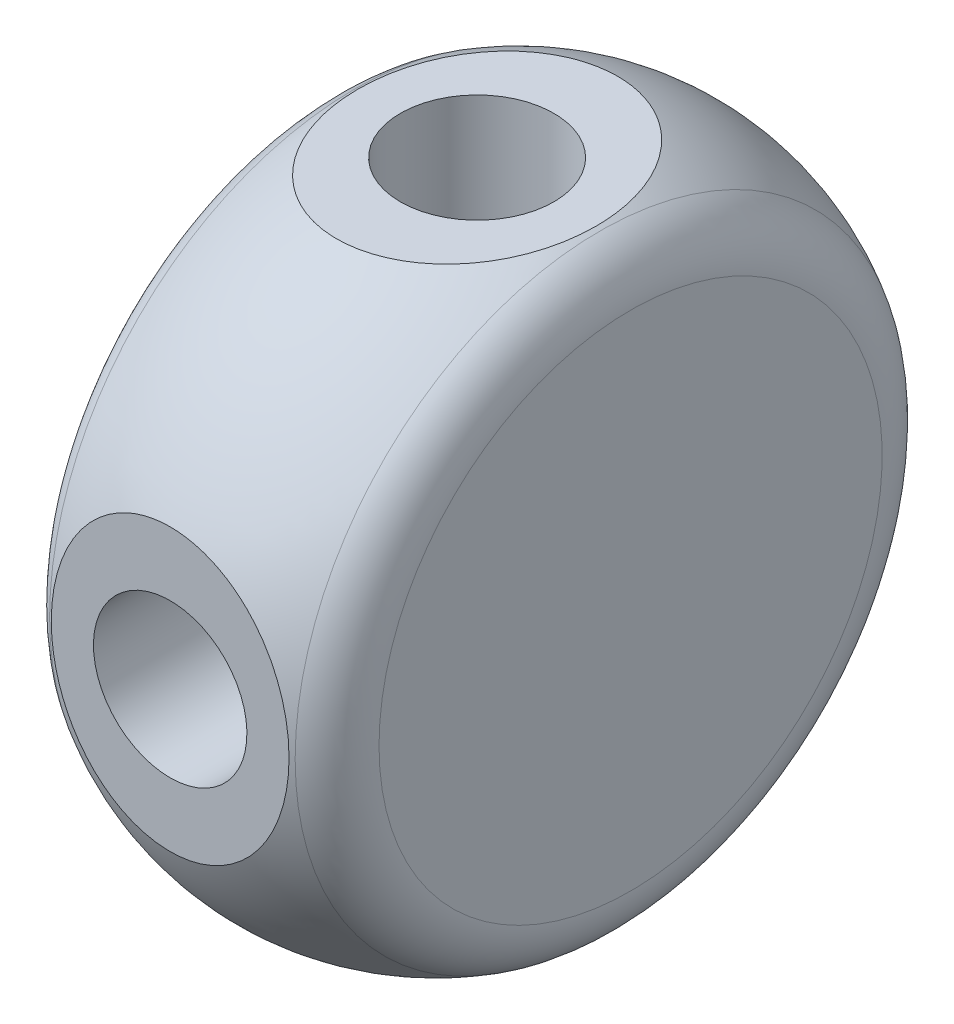
ISO-10303-21;
HEADER;
FILE_DESCRIPTION(('STEP AP214'),'2;1');
FILE_NAME('part.step','',(''),(''),'','','');
FILE_SCHEMA(('AUTOMOTIVE_DESIGN { 1 0 10303 214 1 1 1 1 }'));
ENDSEC;
DATA;
#1=APPLICATION_CONTEXT('core data for automotive mechanical design processes');
#2=APPLICATION_PROTOCOL_DEFINITION('international standard','automotive_design',2000,#1);
#3=PRODUCT_CONTEXT('',#1,'mechanical');
#4=PRODUCT('Part','Part','',(#3));
#5=PRODUCT_RELATED_PRODUCT_CATEGORY('part','',(#4));
#6=PRODUCT_DEFINITION_FORMATION('','',#4);
#7=PRODUCT_DEFINITION_CONTEXT('part definition',#1,'design');
#8=PRODUCT_DEFINITION('design','',#6,#7);
#9=PRODUCT_DEFINITION_SHAPE('','',#8);
#10=(LENGTH_UNIT() NAMED_UNIT(*) SI_UNIT(.MILLI.,.METRE.));
#11=(NAMED_UNIT(*) PLANE_ANGLE_UNIT() SI_UNIT($,.RADIAN.));
#12=(NAMED_UNIT(*) SI_UNIT($,.STERADIAN.) SOLID_ANGLE_UNIT());
#13=UNCERTAINTY_MEASURE_WITH_UNIT(LENGTH_MEASURE(1.E-05),#10,'distance_accuracy_value','');
#14=(GEOMETRIC_REPRESENTATION_CONTEXT(3) GLOBAL_UNCERTAINTY_ASSIGNED_CONTEXT((#13)) GLOBAL_UNIT_ASSIGNED_CONTEXT((#10,
#11,#12)) REPRESENTATION_CONTEXT('',''));
#15=CARTESIAN_POINT('',(0.,0.,0.));
#16=DIRECTION('',(0.,0.,1.));
#17=DIRECTION('',(1.,0.,0.));
#18=AXIS2_PLACEMENT_3D('',#15,#16,#17);
#19=CARTESIAN_POINT('',(5.,-10.,-10.));
#20=DIRECTION('',(0.,0.,1.));
#21=DIRECTION('',(1.,0.,0.));
#22=AXIS2_PLACEMENT_3D('',#19,#20,#21);
#23=PLANE('',#22);
#24=CARTESIAN_POINT('',(3.87298334620741,0.,-10.));
#25=CARTESIAN_POINT('',(3.87298143017548,0.279957520606064,-10.));
#26=CARTESIAN_POINT('',(3.85176677455792,0.559896835077255,-10.));
#27=CARTESIAN_POINT('',(3.7665606306825,1.11326238190932,-10.));
#28=CARTESIAN_POINT('',(3.70257310719076,1.38668921550217,-10.));
#29=CARTESIAN_POINT('',(3.53063827992377,1.9209885462289,-10.));
#30=CARTESIAN_POINT('',(3.42247853053202,2.18179346136854,-10.));
#31=CARTESIAN_POINT('',(3.16168106965632,2.68016623312731,-10.));
#32=CARTESIAN_POINT('',(3.00909782696853,2.91776207335374,-10.));
#33=CARTESIAN_POINT('',(2.69812905853208,3.31134252154961,-10.));
#34=CARTESIAN_POINT('',(2.54804045689744,3.47389174900208,-10.));
#35=CARTESIAN_POINT('',(2.22297414634522,3.77198773760056,-10.));
#36=CARTESIAN_POINT('',(2.04800815895245,3.90754714379708,-10.));
#37=CARTESIAN_POINT('',(1.67557220452734,4.14622112933546,-10.));
#38=CARTESIAN_POINT('',(1.47797598048434,4.24914027458737,-10.));
#39=CARTESIAN_POINT('',(1.06682784799633,4.41572601255386,-10.));
#40=CARTESIAN_POINT('',(0.85328472903932,4.47941405192765,-10.));
#41=CARTESIAN_POINT('',(0.441105690578487,4.55916846131039,-10.));
#42=CARTESIAN_POINT('',(0.243304705010542,4.57958472048624,-10.));
#43=CARTESIAN_POINT('',(-0.152741993315411,4.58495142770175,-10.));
#44=CARTESIAN_POINT('',(-0.350987511995703,4.5699151420116,-10.));
#45=CARTESIAN_POINT('',(-0.73169957258078,4.50685955689153,-10.));
#46=CARTESIAN_POINT('',(-0.914455401704624,4.46055997457647,-10.));
#47=CARTESIAN_POINT('',(-1.26997311343723,4.33889779612495,-10.));
#48=CARTESIAN_POINT('',(-1.4427345131991,4.26353379718619,-10.));
#49=CARTESIAN_POINT('',(-1.77991237755477,4.08390496116987,-10.));
#50=CARTESIAN_POINT('',(-1.94385670259872,3.9787580777535,-10.));
#51=CARTESIAN_POINT('',(-2.25384471642858,3.7448257329369,-10.));
#52=CARTESIAN_POINT('',(-2.39988237417273,3.61603234356777,-10.));
#53=CARTESIAN_POINT('',(-2.6859936426692,3.32488281779702,-10.));
#54=CARTESIAN_POINT('',(-2.82394207693669,3.16044376459161,-10.));
#55=CARTESIAN_POINT('',(-3.07446823495818,2.81331682335827,-10.));
#56=CARTESIAN_POINT('',(-3.18703320948738,2.63061983119233,-10.));
#57=CARTESIAN_POINT('',(-3.4012070866735,2.22364521486725,-10.));
#58=CARTESIAN_POINT('',(-3.49872479002235,1.99721660432412,-10.));
#59=CARTESIAN_POINT('',(-3.66012181783056,1.53270625258898,-10.));
#60=CARTESIAN_POINT('',(-3.72398188120313,1.29461792393192,-10.));
#61=CARTESIAN_POINT('',(-3.82589301940467,0.774545079538806,-10.));
#62=CARTESIAN_POINT('',(-3.85841914412832,0.491470386210998,-10.));
#63=CARTESIAN_POINT('',(-3.8797623491435,-0.0764975538597966,-10.));
#64=CARTESIAN_POINT('',(-3.86853927245221,-0.361392231619545,-10.));
#65=CARTESIAN_POINT('',(-3.79919868038874,-0.951010930343232,-10.));
#66=CARTESIAN_POINT('',(-3.73704175367597,-1.25527397076717,-10.));
#67=CARTESIAN_POINT('',(-3.55967325644482,-1.84789713138825,-10.));
#68=CARTESIAN_POINT('',(-3.44452216046521,-2.13627496018074,-10.));
#69=CARTESIAN_POINT('',(-3.19177243390459,-2.62509422105768,-10.));
#70=CARTESIAN_POINT('',(-3.06463122467638,-2.83095300112767,-10.));
#71=CARTESIAN_POINT('',(-2.77813500787323,-3.21904774045745,-10.));
#72=CARTESIAN_POINT('',(-2.61879457232285,-3.401294324599,-10.));
#73=CARTESIAN_POINT('',(-2.26860556995729,-3.73568762587949,-10.));
#74=CARTESIAN_POINT('',(-2.0775315149527,-3.88760043839341,-10.));
#75=CARTESIAN_POINT('',(-1.6693119944919,-4.15120387188347,-10.));
#76=CARTESIAN_POINT('',(-1.45218892161163,-4.26292871401259,-10.));
#77=CARTESIAN_POINT('',(-1.02975910907204,-4.42713581994434,-10.));
#78=CARTESIAN_POINT('',(-0.826747568730762,-4.48553772753667,-10.));
#79=CARTESIAN_POINT('',(-0.413422167270741,-4.56345958921248,-10.));
#80=CARTESIAN_POINT('',(-0.20311342087555,-4.58300623896564,-10.));
#81=CARTESIAN_POINT('',(0.197552952285403,-4.582171208404,-10.));
#82=CARTESIAN_POINT('',(0.387927831310903,-4.56536982684571,-10.));
#83=CARTESIAN_POINT('',(0.763055929417474,-4.49982767041402,-10.));
#84=CARTESIAN_POINT('',(0.947809914635324,-4.45109126892892,-10.));
#85=CARTESIAN_POINT('',(1.30581844800081,-4.32427503219908,-10.));
#86=CARTESIAN_POINT('',(1.47912677061879,-4.24634590754814,-10.));
#87=CARTESIAN_POINT('',(1.81139768665816,-4.06438519428418,-10.));
#88=CARTESIAN_POINT('',(1.97035692516982,-3.96034752270473,-10.));
#89=CARTESIAN_POINT('',(2.28199602309428,-3.72161990617662,-10.));
#90=CARTESIAN_POINT('',(2.43339017961488,-3.58525722226644,-10.));
#91=CARTESIAN_POINT('',(2.71432030871885,-3.29170374500117,-10.));
#92=CARTESIAN_POINT('',(2.84384820822773,-3.13450529710343,-10.));
#93=CARTESIAN_POINT('',(3.09534301025823,-2.78233628395102,-10.));
#94=CARTESIAN_POINT('',(3.21414782260403,-2.58511126450315,-10.));
#95=CARTESIAN_POINT('',(3.42219491037417,-2.17563216352104,-10.));
#96=CARTESIAN_POINT('',(3.51141207378325,-1.96336550012516,-10.));
#97=CARTESIAN_POINT('',(3.68202450206601,-1.46595625769731,-10.));
#98=CARTESIAN_POINT('',(3.75372710215285,-1.17746503015102,-10.));
#99=CARTESIAN_POINT('',(3.84922375512668,-0.592645848643336,-10.));
#100=CARTESIAN_POINT('',(3.87298537417452,-0.296312726577976,-10.));
#101=CARTESIAN_POINT('',(3.87298334620741,0.,-10.));
#102=B_SPLINE_CURVE_WITH_KNOTS('',3,(#24,#25,#26,#27,#28,#29,#30,#31,#32,#33,#34,#35,#36,#37,
#38,#39,#40,#41,#42,#43,#44,#45,#46,#47,#48,#49,#50,#51,#52,#53,#54,#55,#56,#57,#58,#59,#60,#61,
#62,#63,#64,#65,#66,#67,#68,#69,#70,#71,#72,#73,#74,#75,#76,#77,#78,#79,#80,#81,#82,#83,#84,#85,
#86,#87,#88,#89,#90,#91,#92,#93,#94,#95,#96,#97,#98,#99,#100,#101),.UNSPECIFIED.,.T.,.F.,(4,2,2,
2,2,2,2,2,2,2,2,2,2,2,2,2,2,2,2,2,2,2,2,2,2,2,2,2,2,2,2,2,2,2,2,2,2,2,4),(0.,0.839023297615926,
1.6779688340225,2.52099769417838,3.36299721693534,4.02401079220315,4.68471394224237,
5.34930147599779,6.01352537327571,6.6069987557304,7.20025009689892,7.76327184748769,
8.32632077588248,8.90819515486145,9.49026497641159,10.1316646876194,10.7733858374819,
11.5101408020567,12.2473169291207,13.0985988218639,13.9506622822042,14.8776999717725,
15.8036823812397,16.5266377974021,17.2492667639377,17.9772693063725,18.7046504590106,
19.3348780488382,19.9646724882621,20.5352705946096,21.1057905758863,21.6734048926031,
22.24115157937,22.8499614378851,23.4589955811909,24.1470584206917,24.8357037561689,
25.7231428732277,26.6111821744789),.UNSPECIFIED.);
#103=CARTESIAN_POINT('',(3.87298334620741,0.,-10.));
#104=VERTEX_POINT('',#103);
#105=EDGE_CURVE('E125',#104,#104,#102,.T.);
#106=ORIENTED_EDGE('',*,*,#105,.F.);
#107=EDGE_LOOP('',(#106));
#108=FACE_BOUND('',#107,.T.);
#109=CARTESIAN_POINT('',(0.,1.04744440165294E-13,-10.));
#110=DIRECTION('',(0.,0.,-1.));
#111=DIRECTION('',(0.,1.,0.));
#112=AXIS2_PLACEMENT_3D('',#109,#110,#111);
#113=CIRCLE('',#112,2.49999999999999);
#114=CARTESIAN_POINT('',(0.,2.5000000000001,-9.99999999999998));
#115=VERTEX_POINT('',#114);
#116=EDGE_CURVE('E66',#115,#115,#113,.T.);
#117=ORIENTED_EDGE('',*,*,#116,.F.);
#118=EDGE_LOOP('',(#117));
#119=FACE_BOUND('',#118,.T.);
#120=ADVANCED_FACE('F34',(#108,#119),#23,.F.);
#121=CARTESIAN_POINT('',(5.,-10.,10.));
#122=DIRECTION('',(0.,0.,-1.));
#123=DIRECTION('',(-1.,0.,0.));
#124=AXIS2_PLACEMENT_3D('',#121,#122,#123);
#125=PLANE('',#124);
#126=CARTESIAN_POINT('',(3.87298334620743,0.,10.));
#127=CARTESIAN_POINT('',(3.8729814301755,-0.279957520606058,10.));
#128=CARTESIAN_POINT('',(3.85176677455793,-0.559896835077251,10.));
#129=CARTESIAN_POINT('',(3.76656063068251,-1.11326238190932,10.));
#130=CARTESIAN_POINT('',(3.70257310719077,-1.38668921550217,10.));
#131=CARTESIAN_POINT('',(3.53063827992378,-1.9209885462289,10.));
#132=CARTESIAN_POINT('',(3.42247853053203,-2.18179346136854,10.));
#133=CARTESIAN_POINT('',(3.16168106965633,-2.68016623312732,10.));
#134=CARTESIAN_POINT('',(3.00909782696854,-2.91776207335375,10.));
#135=CARTESIAN_POINT('',(2.69812905853208,-3.31134252154963,10.));
#136=CARTESIAN_POINT('',(2.54804045689745,-3.47389174900209,10.));
#137=CARTESIAN_POINT('',(2.22297414634523,-3.77198773760058,10.));
#138=CARTESIAN_POINT('',(2.04800815895246,-3.90754714379709,10.));
#139=CARTESIAN_POINT('',(1.67557220452735,-4.14622112933548,10.));
#140=CARTESIAN_POINT('',(1.47797598048435,-4.24914027458739,10.));
#141=CARTESIAN_POINT('',(1.06682784799634,-4.41572601255388,10.));
#142=CARTESIAN_POINT('',(0.853284729039325,-4.47941405192766,10.));
#143=CARTESIAN_POINT('',(0.441105690578491,-4.5591684613104,10.));
#144=CARTESIAN_POINT('',(0.243304705010545,-4.57958472048626,10.));
#145=CARTESIAN_POINT('',(-0.152741993315408,-4.58495142770177,10.));
#146=CARTESIAN_POINT('',(-0.350987511995701,-4.56991514201162,10.));
#147=CARTESIAN_POINT('',(-0.731699572580778,-4.50685955689154,10.));
#148=CARTESIAN_POINT('',(-0.914455401704622,-4.46055997457648,10.));
#149=CARTESIAN_POINT('',(-1.26997311343723,-4.33889779612497,10.));
#150=CARTESIAN_POINT('',(-1.4427345131991,-4.2635337971862,10.));
#151=CARTESIAN_POINT('',(-1.77991237755478,-4.08390496116989,10.));
#152=CARTESIAN_POINT('',(-1.94385670259872,-3.97875807775352,10.));
#153=CARTESIAN_POINT('',(-2.25384471642859,-3.74482573293691,10.));
#154=CARTESIAN_POINT('',(-2.39988237417274,-3.61603234356779,10.));
#155=CARTESIAN_POINT('',(-2.68599364266921,-3.32488281779704,10.));
#156=CARTESIAN_POINT('',(-2.8239420769367,-3.16044376459162,10.));
#157=CARTESIAN_POINT('',(-3.07446823495819,-2.81331682335829,10.));
#158=CARTESIAN_POINT('',(-3.18703320948738,-2.63061983119235,10.));
#159=CARTESIAN_POINT('',(-3.40120708667351,-2.22364521486726,10.));
#160=CARTESIAN_POINT('',(-3.49872479002236,-1.99721660432413,10.));
#161=CARTESIAN_POINT('',(-3.66012181783057,-1.53270625258899,10.));
#162=CARTESIAN_POINT('',(-3.72398188120314,-1.29461792393193,10.));
#163=CARTESIAN_POINT('',(-3.82589301940468,-0.774545079538814,10.));
#164=CARTESIAN_POINT('',(-3.85841914412833,-0.491470386211007,10.));
#165=CARTESIAN_POINT('',(-3.87976234914352,0.0764975538597888,10.));
#166=CARTESIAN_POINT('',(-3.86853927245222,0.361392231619539,10.));
#167=CARTESIAN_POINT('',(-3.79919868038875,0.951010930343229,10.));
#168=CARTESIAN_POINT('',(-3.73704175367599,1.25527397076717,10.));
#169=CARTESIAN_POINT('',(-3.55967325644484,1.84789713138825,10.));
#170=CARTESIAN_POINT('',(-3.44452216046522,2.13627496018074,10.));
#171=CARTESIAN_POINT('',(-3.19177243390461,2.62509422105769,10.));
#172=CARTESIAN_POINT('',(-3.06463122467639,2.83095300112768,10.));
#173=CARTESIAN_POINT('',(-2.77813500787325,3.21904774045746,10.));
#174=CARTESIAN_POINT('',(-2.61879457232286,3.40129432459901,10.));
#175=CARTESIAN_POINT('',(-2.2686055699573,3.7356876258795,10.));
#176=CARTESIAN_POINT('',(-2.07753151495271,3.88760043839342,10.));
#177=CARTESIAN_POINT('',(-1.66931199449192,4.15120387188348,10.));
#178=CARTESIAN_POINT('',(-1.45218892161164,4.2629287140126,10.));
#179=CARTESIAN_POINT('',(-1.02975910907205,4.42713581994436,10.));
#180=CARTESIAN_POINT('',(-0.826747568730772,4.48553772753668,10.));
#181=CARTESIAN_POINT('',(-0.413422167270748,4.56345958921249,10.));
#182=CARTESIAN_POINT('',(-0.203113420875558,4.58300623896565,10.));
#183=CARTESIAN_POINT('',(0.197552952285397,4.58217120840401,10.));
#184=CARTESIAN_POINT('',(0.387927831310898,4.56536982684573,10.));
#185=CARTESIAN_POINT('',(0.763055929417471,4.49982767041404,10.));
#186=CARTESIAN_POINT('',(0.947809914635321,4.45109126892894,10.));
#187=CARTESIAN_POINT('',(1.30581844800081,4.3242750321991,10.));
#188=CARTESIAN_POINT('',(1.47912677061879,4.24634590754816,10.));
#189=CARTESIAN_POINT('',(1.81139768665816,4.0643851942842,10.));
#190=CARTESIAN_POINT('',(1.97035692516982,3.96034752270475,10.));
#191=CARTESIAN_POINT('',(2.28199602309429,3.72161990617664,10.));
#192=CARTESIAN_POINT('',(2.43339017961488,3.58525722226646,10.));
#193=CARTESIAN_POINT('',(2.71432030871885,3.29170374500119,10.));
#194=CARTESIAN_POINT('',(2.84384820822774,3.13450529710345,10.));
#195=CARTESIAN_POINT('',(3.09534301025824,2.78233628395104,10.));
#196=CARTESIAN_POINT('',(3.21414782260404,2.58511126450317,10.));
#197=CARTESIAN_POINT('',(3.42219491037418,2.17563216352106,10.));
#198=CARTESIAN_POINT('',(3.51141207378326,1.96336550012518,10.));
#199=CARTESIAN_POINT('',(3.68202450206602,1.46595625769733,10.));
#200=CARTESIAN_POINT('',(3.75372710215286,1.17746503015103,10.));
#201=CARTESIAN_POINT('',(3.84922375512669,0.592645848643346,10.));
#202=CARTESIAN_POINT('',(3.87298537417454,0.296312726577984,10.));
#203=CARTESIAN_POINT('',(3.87298334620743,0.,10.));
#204=B_SPLINE_CURVE_WITH_KNOTS('',3,(#126,#127,#128,#129,#130,#131,#132,#133,#134,#135,#136,
#137,#138,#139,#140,#141,#142,#143,#144,#145,#146,#147,#148,#149,#150,#151,#152,#153,#154,#155,
#156,#157,#158,#159,#160,#161,#162,#163,#164,#165,#166,#167,#168,#169,#170,#171,#172,#173,#174,
#175,#176,#177,#178,#179,#180,#181,#182,#183,#184,#185,#186,#187,#188,#189,#190,#191,#192,#193,
#194,#195,#196,#197,#198,#199,#200,#201,#202,#203),.UNSPECIFIED.,.T.,.F.,(4,2,2,2,2,2,2,2,2,2,2,
2,2,2,2,2,2,2,2,2,2,2,2,2,2,2,2,2,2,2,2,2,2,2,2,2,2,2,4),(0.,0.839023297615931,1.67796883402251,
2.52099769417839,3.36299721693536,4.02401079220317,4.68471394224239,5.34930147599781,
6.01352537327574,6.60699875573042,7.20025009689894,7.76327184748772,8.32632077588252,
8.90819515486149,9.49026497641163,10.1316646876195,10.773385837482,11.5101408020567,
12.2473169291208,13.098598821864,13.9506622822043,14.8776999717725,15.8036823812397,
16.5266377974022,17.2492667639378,17.9772693063725,18.7046504590107,19.3348780488382,
19.9646724882622,20.5352705946097,21.1057905758863,21.6734048926032,22.24115157937,
22.8499614378852,23.4589955811909,24.1470584206917,24.835703756169,25.7231428732278,
26.611182174479),.UNSPECIFIED.);
#205=CARTESIAN_POINT('',(3.87298334620743,0.,10.));
#206=VERTEX_POINT('',#205);
#207=EDGE_CURVE('E96',#206,#206,#204,.T.);
#208=ORIENTED_EDGE('',*,*,#207,.F.);
#209=EDGE_LOOP('',(#208));
#210=FACE_BOUND('',#209,.T.);
#211=CARTESIAN_POINT('',(0.,0.,10.));
#212=DIRECTION('',(0.,0.,1.));
#213=DIRECTION('',(0.,-1.,0.));
#214=AXIS2_PLACEMENT_3D('',#211,#212,#213);
#215=CIRCLE('',#214,2.49999999999999);
#216=CARTESIAN_POINT('',(0.,-2.50000000000003,10.));
#217=VERTEX_POINT('',#216);
#218=EDGE_CURVE('E76',#217,#217,#215,.T.);
#219=ORIENTED_EDGE('',*,*,#218,.F.);
#220=EDGE_LOOP('',(#219));
#221=FACE_BOUND('',#220,.T.);
#222=ADVANCED_FACE('F111',(#210,#221),#125,.F.);
#223=CARTESIAN_POINT('',(0.,0.,0.));
#224=DIRECTION('',(-1.,0.,0.));
#225=DIRECTION('',(0.,0.,1.));
#226=AXIS2_PLACEMENT_3D('',#223,#224,#225);
#227=DEGENERATE_TOROIDAL_SURFACE('',#226,3.,8.,.T.);
#228=CARTESIAN_POINT('',(-4.,0.,0.));
#229=DIRECTION('',(1.,0.,0.));
#230=DIRECTION('',(0.,0.,-1.));
#231=AXIS2_PLACEMENT_3D('',#228,#229,#230);
#232=CIRCLE('',#231,9.92820323027551);
#233=CARTESIAN_POINT('',(-4.,0.,-9.92820323027551));
#234=VERTEX_POINT('',#233);
#235=EDGE_CURVE('E42',#234,#234,#232,.T.);
#236=ORIENTED_EDGE('',*,*,#235,.T.);
#237=EDGE_LOOP('',(#236));
#238=FACE_BOUND('',#237,.T.);
#239=CARTESIAN_POINT('',(4.,0.,0.));
#240=DIRECTION('',(-1.,0.,0.));
#241=DIRECTION('',(0.,0.,1.));
#242=AXIS2_PLACEMENT_3D('',#239,#240,#241);
#243=CIRCLE('',#242,9.92820323027551);
#244=CARTESIAN_POINT('',(4.,0.,9.92820323027551));
#245=VERTEX_POINT('',#244);
#246=EDGE_CURVE('E156',#245,#245,#243,.T.);
#247=ORIENTED_EDGE('',*,*,#246,.T.);
#248=EDGE_LOOP('',(#247));
#249=FACE_BOUND('',#248,.T.);
#250=CARTESIAN_POINT('',(3.87298334620743,-10.,0.));
#251=CARTESIAN_POINT('',(3.8729814301755,-10.,-0.279957520606065));
#252=CARTESIAN_POINT('',(3.85176677455793,-10.,-0.559896835077258));
#253=CARTESIAN_POINT('',(3.76656063068251,-10.,-1.11326238190933));
#254=CARTESIAN_POINT('',(3.70257310719077,-10.,-1.38668921550217));
#255=CARTESIAN_POINT('',(3.53063827992378,-10.,-1.92098854622891));
#256=CARTESIAN_POINT('',(3.42247853053203,-10.,-2.18179346136855));
#257=CARTESIAN_POINT('',(3.16168106965633,-10.,-2.68016623312733));
#258=CARTESIAN_POINT('',(3.00909782696854,-10.,-2.91776207335375));
#259=CARTESIAN_POINT('',(2.69812905853208,-10.,-3.31134252154963));
#260=CARTESIAN_POINT('',(2.54804045689744,-10.,-3.4738917490021));
#261=CARTESIAN_POINT('',(2.22297414634522,-10.,-3.77198773760058));
#262=CARTESIAN_POINT('',(2.04800815895245,-10.,-3.9075471437971));
#263=CARTESIAN_POINT('',(1.67557220452734,-10.,-4.14622112933548));
#264=CARTESIAN_POINT('',(1.47797598048434,-10.,-4.24914027458739));
#265=CARTESIAN_POINT('',(1.06682784799633,-10.,-4.41572601255388));
#266=CARTESIAN_POINT('',(0.85328472903932,-10.,-4.47941405192766));
#267=CARTESIAN_POINT('',(0.441105690578486,-10.,-4.5591684613104));
#268=CARTESIAN_POINT('',(0.24330470501054,-10.,-4.57958472048626));
#269=CARTESIAN_POINT('',(-0.152741993315414,-10.,-4.58495142770177));
#270=CARTESIAN_POINT('',(-0.350987511995707,-10.,-4.56991514201162));
#271=CARTESIAN_POINT('',(-0.731699572580785,-10.,-4.50685955689154));
#272=CARTESIAN_POINT('',(-0.91445540170463,-10.,-4.46055997457649));
#273=CARTESIAN_POINT('',(-1.26997311343723,-10.,-4.33889779612497));
#274=CARTESIAN_POINT('',(-1.4427345131991,-10.,-4.2635337971862));
#275=CARTESIAN_POINT('',(-1.77991237755478,-10.,-4.08390496116988));
#276=CARTESIAN_POINT('',(-1.94385670259873,-10.,-3.97875807775351));
#277=CARTESIAN_POINT('',(-2.25384471642859,-10.,-3.74482573293691));
#278=CARTESIAN_POINT('',(-2.39988237417274,-10.,-3.61603234356778));
#279=CARTESIAN_POINT('',(-2.68599364266921,-10.,-3.32488281779703));
#280=CARTESIAN_POINT('',(-2.8239420769367,-10.,-3.16044376459162));
#281=CARTESIAN_POINT('',(-3.07446823495819,-10.,-2.81331682335828));
#282=CARTESIAN_POINT('',(-3.18703320948739,-10.,-2.63061983119234));
#283=CARTESIAN_POINT('',(-3.40120708667351,-10.,-2.22364521486725));
#284=CARTESIAN_POINT('',(-3.49872479002237,-10.,-1.99721660432413));
#285=CARTESIAN_POINT('',(-3.66012181783058,-10.,-1.53270625258898));
#286=CARTESIAN_POINT('',(-3.72398188120314,-10.,-1.29461792393192));
#287=CARTESIAN_POINT('',(-3.82589301940468,-10.,-0.774545079538805));
#288=CARTESIAN_POINT('',(-3.85841914412833,-10.,-0.491470386210997));
#289=CARTESIAN_POINT('',(-3.87976234914352,-10.,0.0764975538597993));
#290=CARTESIAN_POINT('',(-3.86853927245222,-10.,0.361392231619549));
#291=CARTESIAN_POINT('',(-3.79919868038875,-10.,0.951010930343238));
#292=CARTESIAN_POINT('',(-3.73704175367598,-10.,1.25527397076718));
#293=CARTESIAN_POINT('',(-3.55967325644483,-10.,1.84789713138826));
#294=CARTESIAN_POINT('',(-3.44452216046522,-10.,2.13627496018075));
#295=CARTESIAN_POINT('',(-3.1917724339046,-10.,2.62509422105769));
#296=CARTESIAN_POINT('',(-3.06463122467638,-10.,2.83095300112768));
#297=CARTESIAN_POINT('',(-2.77813500787324,-10.,3.21904774045746));
#298=CARTESIAN_POINT('',(-2.61879457232285,-10.,3.40129432459901));
#299=CARTESIAN_POINT('',(-2.26860556995729,-10.,3.73568762587951));
#300=CARTESIAN_POINT('',(-2.0775315149527,-10.,3.88760043839343));
#301=CARTESIAN_POINT('',(-1.66931199449191,-10.,4.15120387188348));
#302=CARTESIAN_POINT('',(-1.45218892161164,-10.,4.26292871401261));
#303=CARTESIAN_POINT('',(-1.02975910907205,-10.,4.42713581994436));
#304=CARTESIAN_POINT('',(-0.826747568730765,-10.,4.48553772753669));
#305=CARTESIAN_POINT('',(-0.413422167270742,-10.,4.56345958921249));
#306=CARTESIAN_POINT('',(-0.203113420875551,-10.,4.58300623896565));
#307=CARTESIAN_POINT('',(0.197552952285402,-10.,4.58217120840401));
#308=CARTESIAN_POINT('',(0.387927831310902,-10.,4.56536982684573));
#309=CARTESIAN_POINT('',(0.763055929417475,-10.,4.49982767041404));
#310=CARTESIAN_POINT('',(0.947809914635326,-10.,4.45109126892894));
#311=CARTESIAN_POINT('',(1.30581844800081,-10.,4.3242750321991));
#312=CARTESIAN_POINT('',(1.47912677061879,-10.,4.24634590754815));
#313=CARTESIAN_POINT('',(1.81139768665816,-10.,4.0643851942842));
#314=CARTESIAN_POINT('',(1.97035692516983,-10.,3.96034752270474));
#315=CARTESIAN_POINT('',(2.28199602309429,-10.,3.72161990617664));
#316=CARTESIAN_POINT('',(2.43339017961489,-10.,3.58525722226645));
#317=CARTESIAN_POINT('',(2.71432030871886,-10.,3.29170374500119));
#318=CARTESIAN_POINT('',(2.84384820822774,-10.,3.13450529710345));
#319=CARTESIAN_POINT('',(3.09534301025824,-10.,2.78233628395103));
#320=CARTESIAN_POINT('',(3.21414782260404,-10.,2.58511126450317));
#321=CARTESIAN_POINT('',(3.42219491037419,-10.,2.17563216352105));
#322=CARTESIAN_POINT('',(3.51141207378326,-10.,1.96336550012517));
#323=CARTESIAN_POINT('',(3.68202450206602,-10.,1.46595625769732));
#324=CARTESIAN_POINT('',(3.75372710215286,-10.,1.17746503015102));
#325=CARTESIAN_POINT('',(3.84922375512669,-10.,0.592645848643339));
#326=CARTESIAN_POINT('',(3.87298537417454,-10.,0.296312726577977));
#327=CARTESIAN_POINT('',(3.87298334620743,-10.,0.));
#328=B_SPLINE_CURVE_WITH_KNOTS('',3,(#250,#251,#252,#253,#254,#255,#256,#257,#258,#259,#260,
#261,#262,#263,#264,#265,#266,#267,#268,#269,#270,#271,#272,#273,#274,#275,#276,#277,#278,#279,
#280,#281,#282,#283,#284,#285,#286,#287,#288,#289,#290,#291,#292,#293,#294,#295,#296,#297,#298,
#299,#300,#301,#302,#303,#304,#305,#306,#307,#308,#309,#310,#311,#312,#313,#314,#315,#316,#317,
#318,#319,#320,#321,#322,#323,#324,#325,#326,#327),.UNSPECIFIED.,.T.,.F.,(4,2,2,2,2,2,2,2,2,2,2,
2,2,2,2,2,2,2,2,2,2,2,2,2,2,2,2,2,2,2,2,2,2,2,2,2,2,2,4),(0.,0.83902329761593,1.67796883402251,
2.5209976941784,3.36299721693536,4.02401079220317,4.68471394224239,5.34930147599781,
6.01352537327574,6.60699875573042,7.20025009689895,7.76327184748772,8.32632077588252,
8.90819515486149,9.49026497641163,10.1316646876195,10.773385837482,11.5101408020567,
12.2473169291208,13.098598821864,13.9506622822043,14.8776999717725,15.8036823812397,
16.5266377974022,17.2492667639378,17.9772693063725,18.7046504590107,19.3348780488382,
19.9646724882622,20.5352705946097,21.1057905758863,21.6734048926032,22.2411515793701,
22.8499614378852,23.458995581191,24.1470584206917,24.835703756169,25.7231428732278,
26.611182174479),.UNSPECIFIED.);
#329=CARTESIAN_POINT('',(3.87298334620743,-10.,0.));
#330=VERTEX_POINT('',#329);
#331=EDGE_CURVE('E88',#330,#330,#328,.T.);
#332=ORIENTED_EDGE('',*,*,#331,.T.);
#333=EDGE_LOOP('',(#332));
#334=FACE_BOUND('',#333,.T.);
#335=ORIENTED_EDGE('',*,*,#207,.T.);
#336=EDGE_LOOP('',(#335));
#337=FACE_BOUND('',#336,.T.);
#338=CARTESIAN_POINT('',(3.87298334620741,10.,0.));
#339=CARTESIAN_POINT('',(3.87298143017548,10.,0.279957520606057));
#340=CARTESIAN_POINT('',(3.85176677455791,10.,0.559896835077249));
#341=CARTESIAN_POINT('',(3.7665606306825,10.,1.11326238190931));
#342=CARTESIAN_POINT('',(3.70257310719076,10.,1.38668921550216));
#343=CARTESIAN_POINT('',(3.53063827992377,10.,1.92098854622889));
#344=CARTESIAN_POINT('',(3.42247853053202,10.,2.18179346136853));
#345=CARTESIAN_POINT('',(3.16168106965632,10.,2.68016623312731));
#346=CARTESIAN_POINT('',(3.00909782696853,10.,2.91776207335373));
#347=CARTESIAN_POINT('',(2.69812905853208,10.,3.31134252154961));
#348=CARTESIAN_POINT('',(2.54804045689744,10.,3.47389174900208));
#349=CARTESIAN_POINT('',(2.22297414634523,10.,3.77198773760057));
#350=CARTESIAN_POINT('',(2.04800815895245,10.,3.90754714379708));
#351=CARTESIAN_POINT('',(1.67557220452734,10.,4.14622112933546));
#352=CARTESIAN_POINT('',(1.47797598048435,10.,4.24914027458737));
#353=CARTESIAN_POINT('',(1.06682784799634,10.,4.41572601255386));
#354=CARTESIAN_POINT('',(0.853284729039326,10.,4.47941405192765));
#355=CARTESIAN_POINT('',(0.441105690578493,10.,4.55916846131039));
#356=CARTESIAN_POINT('',(0.243304705010548,10.,4.57958472048625));
#357=CARTESIAN_POINT('',(-0.152741993315405,10.,4.58495142770175));
#358=CARTESIAN_POINT('',(-0.350987511995697,10.,4.5699151420116));
#359=CARTESIAN_POINT('',(-0.731699572580774,10.,4.50685955689153));
#360=CARTESIAN_POINT('',(-0.914455401704618,10.,4.46055997457647));
#361=CARTESIAN_POINT('',(-1.26997311343722,10.,4.33889779612496));
#362=CARTESIAN_POINT('',(-1.44273451319909,10.,4.26353379718619));
#363=CARTESIAN_POINT('',(-1.77991237755477,10.,4.08390496116987));
#364=CARTESIAN_POINT('',(-1.94385670259871,10.,3.9787580777535));
#365=CARTESIAN_POINT('',(-2.25384471642858,10.,3.7448257329369));
#366=CARTESIAN_POINT('',(-2.39988237417273,10.,3.61603234356777));
#367=CARTESIAN_POINT('',(-2.6859936426692,10.,3.32488281779703));
#368=CARTESIAN_POINT('',(-2.82394207693668,10.,3.16044376459161));
#369=CARTESIAN_POINT('',(-3.07446823495817,10.,2.81331682335828));
#370=CARTESIAN_POINT('',(-3.18703320948737,10.,2.63061983119234));
#371=CARTESIAN_POINT('',(-3.40120708667349,10.,2.22364521486725));
#372=CARTESIAN_POINT('',(-3.49872479002235,10.,1.99721660432413));
#373=CARTESIAN_POINT('',(-3.66012181783056,10.,1.53270625258898));
#374=CARTESIAN_POINT('',(-3.72398188120312,10.,1.29461792393193));
#375=CARTESIAN_POINT('',(-3.82589301940467,10.,0.774545079538816));
#376=CARTESIAN_POINT('',(-3.85841914412832,10.,0.49147038621101));
#377=CARTESIAN_POINT('',(-3.8797623491435,10.,-0.0764975538597848));
#378=CARTESIAN_POINT('',(-3.86853927245221,10.,-0.361392231619533));
#379=CARTESIAN_POINT('',(-3.79919868038874,10.,-0.95101093034322));
#380=CARTESIAN_POINT('',(-3.73704175367597,10.,-1.25527397076716));
#381=CARTESIAN_POINT('',(-3.55967325644483,10.,-1.84789713138824));
#382=CARTESIAN_POINT('',(-3.44452216046521,10.,-2.13627496018073));
#383=CARTESIAN_POINT('',(-3.1917724339046,10.,-2.62509422105767));
#384=CARTESIAN_POINT('',(-3.06463122467638,10.,-2.83095300112766));
#385=CARTESIAN_POINT('',(-2.77813500787324,10.,-3.21904774045744));
#386=CARTESIAN_POINT('',(-2.61879457232286,10.,-3.40129432459899));
#387=CARTESIAN_POINT('',(-2.2686055699573,10.,-3.73568762587949));
#388=CARTESIAN_POINT('',(-2.07753151495271,10.,-3.8876004383934));
#389=CARTESIAN_POINT('',(-1.66931199449191,10.,-4.15120387188346));
#390=CARTESIAN_POINT('',(-1.45218892161164,10.,-4.26292871401259));
#391=CARTESIAN_POINT('',(-1.02975910907206,10.,-4.42713581994434));
#392=CARTESIAN_POINT('',(-0.826747568730773,10.,-4.48553772753666));
#393=CARTESIAN_POINT('',(-0.41342216727075,10.,-4.56345958921247));
#394=CARTESIAN_POINT('',(-0.20311342087556,10.,-4.58300623896563));
#395=CARTESIAN_POINT('',(0.197552952285393,10.,-4.582171208404));
#396=CARTESIAN_POINT('',(0.387927831310892,10.,-4.56536982684571));
#397=CARTESIAN_POINT('',(0.763055929417463,10.,-4.49982767041402));
#398=CARTESIAN_POINT('',(0.947809914635314,10.,-4.45109126892893));
#399=CARTESIAN_POINT('',(1.3058184480008,10.,-4.32427503219909));
#400=CARTESIAN_POINT('',(1.47912677061878,10.,-4.24634590754814));
#401=CARTESIAN_POINT('',(1.81139768665814,10.,-4.06438519428419));
#402=CARTESIAN_POINT('',(1.97035692516981,10.,-3.96034752270473));
#403=CARTESIAN_POINT('',(2.28199602309428,10.,-3.72161990617663));
#404=CARTESIAN_POINT('',(2.43339017961487,10.,-3.58525722226645));
#405=CARTESIAN_POINT('',(2.71432030871884,10.,-3.29170374500118));
#406=CARTESIAN_POINT('',(2.84384820822772,10.,-3.13450529710344));
#407=CARTESIAN_POINT('',(3.09534301025822,10.,-2.78233628395103));
#408=CARTESIAN_POINT('',(3.21414782260402,10.,-2.58511126450317));
#409=CARTESIAN_POINT('',(3.42219491037417,10.,-2.17563216352105));
#410=CARTESIAN_POINT('',(3.51141207378324,10.,-1.96336550012517));
#411=CARTESIAN_POINT('',(3.682024502066,10.,-1.46595625769733));
#412=CARTESIAN_POINT('',(3.75372710215285,10.,-1.17746503015103));
#413=CARTESIAN_POINT('',(3.84922375512667,10.,-0.592645848643345));
#414=CARTESIAN_POINT('',(3.87298537417452,10.,-0.296312726577984));
#415=CARTESIAN_POINT('',(3.87298334620741,10.,0.));
#416=B_SPLINE_CURVE_WITH_KNOTS('',3,(#338,#339,#340,#341,#342,#343,#344,#345,#346,#347,#348,
#349,#350,#351,#352,#353,#354,#355,#356,#357,#358,#359,#360,#361,#362,#363,#364,#365,#366,#367,
#368,#369,#370,#371,#372,#373,#374,#375,#376,#377,#378,#379,#380,#381,#382,#383,#384,#385,#386,
#387,#388,#389,#390,#391,#392,#393,#394,#395,#396,#397,#398,#399,#400,#401,#402,#403,#404,#405,
#406,#407,#408,#409,#410,#411,#412,#413,#414,#415),.UNSPECIFIED.,.T.,.F.,(4,2,2,2,2,2,2,2,2,2,2,
2,2,2,2,2,2,2,2,2,2,2,2,2,2,2,2,2,2,2,2,2,2,2,2,2,2,2,4),(0.,0.839023297615927,1.6779688340225,
2.52099769417838,3.36299721693534,4.02401079220315,4.68471394224237,5.34930147599779,
6.01352537327572,6.6069987557304,7.20025009689892,7.76327184748769,8.32632077588249,
8.90819515486146,9.49026497641159,10.1316646876194,10.7733858374819,11.5101408020567,
12.2473169291207,13.0985988218639,13.9506622822042,14.8776999717725,15.8036823812397,
16.5266377974021,17.2492667639377,17.9772693063725,18.7046504590106,19.3348780488382,
19.9646724882621,20.5352705946096,21.1057905758863,21.6734048926031,22.24115157937,
22.8499614378851,23.4589955811909,24.1470584206917,24.8357037561689,25.7231428732277,
26.6111821744789),.UNSPECIFIED.);
#417=CARTESIAN_POINT('',(3.87298334620741,10.,0.));
#418=VERTEX_POINT('',#417);
#419=EDGE_CURVE('E119',#418,#418,#416,.T.);
#420=ORIENTED_EDGE('',*,*,#419,.T.);
#421=EDGE_LOOP('',(#420));
#422=FACE_BOUND('',#421,.T.);
#423=ORIENTED_EDGE('',*,*,#105,.T.);
#424=EDGE_LOOP('',(#423));
#425=FACE_BOUND('',#424,.T.);
#426=ADVANCED_FACE('F105',(#238,#249,#334,#337,#422,#425),#227,.T.);
#427=CARTESIAN_POINT('',(5.,0.,0.));
#428=DIRECTION('',(-1.,0.,0.));
#429=DIRECTION('',(0.,0.,1.));
#430=AXIS2_PLACEMENT_3D('',#427,#428,#429);
#431=PLANE('',#430);
#432=CARTESIAN_POINT('',(5.,0.,0.));
#433=DIRECTION('',(-1.,0.,0.));
#434=DIRECTION('',(0.,0.,1.));
#435=AXIS2_PLACEMENT_3D('',#432,#433,#434);
#436=CIRCLE('',#435,8.19615242270663);
#437=CARTESIAN_POINT('',(5.,0.,8.19615242270663));
#438=VERTEX_POINT('',#437);
#439=EDGE_CURVE('E11',#438,#438,#436,.F.);
#440=ORIENTED_EDGE('',*,*,#439,.T.);
#441=EDGE_LOOP('',(#440));
#442=FACE_BOUND('',#441,.T.);
#443=ADVANCED_FACE('F110',(#442),#431,.F.);
#444=CARTESIAN_POINT('',(5.,-10.,10.));
#445=DIRECTION('',(0.,1.,0.));
#446=DIRECTION('',(0.,0.,1.));
#447=AXIS2_PLACEMENT_3D('',#444,#445,#446);
#448=PLANE('',#447);
#449=CARTESIAN_POINT('',(0.,-10.,0.));
#450=DIRECTION('',(0.,-1.,0.));
#451=DIRECTION('',(0.,0.,-1.));
#452=AXIS2_PLACEMENT_3D('',#449,#450,#451);
#453=CIRCLE('',#452,2.49999999999999);
#454=CARTESIAN_POINT('',(0.,-10.,-2.49999999999999));
#455=VERTEX_POINT('',#454);
#456=EDGE_CURVE('E65',#455,#455,#453,.T.);
#457=ORIENTED_EDGE('',*,*,#456,.F.);
#458=EDGE_LOOP('',(#457));
#459=FACE_BOUND('',#458,.T.);
#460=ORIENTED_EDGE('',*,*,#331,.F.);
#461=EDGE_LOOP('',(#460));
#462=FACE_BOUND('',#461,.T.);
#463=ADVANCED_FACE('F102',(#459,#462),#448,.F.);
#464=CARTESIAN_POINT('',(5.,10.,10.));
#465=DIRECTION('',(0.,-1.,0.));
#466=DIRECTION('',(0.,0.,-1.));
#467=AXIS2_PLACEMENT_3D('',#464,#465,#466);
#468=PLANE('',#467);
#469=CARTESIAN_POINT('',(0.,10.,0.));
#470=DIRECTION('',(0.,1.,0.));
#471=DIRECTION('',(0.,0.,1.));
#472=AXIS2_PLACEMENT_3D('',#469,#470,#471);
#473=CIRCLE('',#472,2.49999999999999);
#474=CARTESIAN_POINT('',(0.,10.,2.49999999999999));
#475=VERTEX_POINT('',#474);
#476=EDGE_CURVE('E82',#475,#475,#473,.T.);
#477=ORIENTED_EDGE('',*,*,#476,.F.);
#478=EDGE_LOOP('',(#477));
#479=FACE_BOUND('',#478,.T.);
#480=ORIENTED_EDGE('',*,*,#419,.F.);
#481=EDGE_LOOP('',(#480));
#482=FACE_BOUND('',#481,.T.);
#483=ADVANCED_FACE('F131',(#479,#482),#468,.F.);
#484=CARTESIAN_POINT('',(-5.,0.,0.));
#485=DIRECTION('',(-1.,0.,0.));
#486=DIRECTION('',(0.,0.,1.));
#487=AXIS2_PLACEMENT_3D('',#484,#485,#486);
#488=PLANE('',#487);
#489=CARTESIAN_POINT('',(-5.,0.,0.));
#490=DIRECTION('',(-1.,0.,0.));
#491=DIRECTION('',(0.,0.,1.));
#492=AXIS2_PLACEMENT_3D('',#489,#490,#491);
#493=CIRCLE('',#492,8.19615242270663);
#494=CARTESIAN_POINT('',(-5.,0.,8.19615242270663));
#495=VERTEX_POINT('',#494);
#496=EDGE_CURVE('E154',#495,#495,#493,.T.);
#497=ORIENTED_EDGE('',*,*,#496,.T.);
#498=EDGE_LOOP('',(#497));
#499=FACE_BOUND('',#498,.T.);
#500=ADVANCED_FACE('F134',(#499),#488,.T.);
#501=CARTESIAN_POINT('',(0.,4.00000000000001,0.));
#502=DIRECTION('',(0.,1.,0.));
#503=DIRECTION('',(0.,0.,1.));
#504=AXIS2_PLACEMENT_3D('',#501,#502,#503);
#505=CONICAL_SURFACE('',#504,2.5,1.02974425867665);
#506=CARTESIAN_POINT('',(0.,2.4978484524311,0.));
#507=VERTEX_POINT('',#506);
#508=VERTEX_LOOP('',#507);
#509=FACE_BOUND('',#508,.T.);
#510=CARTESIAN_POINT('',(0.,4.00000000000001,0.));
#511=DIRECTION('',(0.,1.,0.));
#512=DIRECTION('',(0.,0.,1.));
#513=AXIS2_PLACEMENT_3D('',#510,#511,#512);
#514=CIRCLE('',#513,2.5);
#515=CARTESIAN_POINT('',(0.,4.00000000000001,2.5));
#516=VERTEX_POINT('',#515);
#517=EDGE_CURVE('E85',#516,#516,#514,.T.);
#518=ORIENTED_EDGE('',*,*,#517,.T.);
#519=EDGE_LOOP('',(#518));
#520=FACE_BOUND('',#519,.T.);
#521=ADVANCED_FACE('F113',(#509,#520),#505,.F.);
#522=CARTESIAN_POINT('',(0.,10.,0.));
#523=DIRECTION('',(0.,1.,0.));
#524=DIRECTION('',(0.,0.,1.));
#525=AXIS2_PLACEMENT_3D('',#522,#523,#524);
#526=CYLINDRICAL_SURFACE('',#525,2.49999999999999);
#527=ORIENTED_EDGE('',*,*,#517,.F.);
#528=EDGE_LOOP('',(#527));
#529=FACE_BOUND('',#528,.T.);
#530=ORIENTED_EDGE('',*,*,#476,.T.);
#531=EDGE_LOOP('',(#530));
#532=FACE_BOUND('',#531,.T.);
#533=ADVANCED_FACE('F192',(#529,#532),#526,.F.);
#534=CARTESIAN_POINT('',(0.,0.,4.00000000000001));
#535=DIRECTION('',(0.,0.,1.));
#536=DIRECTION('',(0.,-1.,0.));
#537=AXIS2_PLACEMENT_3D('',#534,#535,#536);
#538=CONICAL_SURFACE('',#537,2.5,1.02974425867665);
#539=CARTESIAN_POINT('',(0.,0.,2.4978484524311));
#540=VERTEX_POINT('',#539);
#541=VERTEX_LOOP('',#540);
#542=FACE_BOUND('',#541,.T.);
#543=CARTESIAN_POINT('',(0.,0.,4.00000000000001));
#544=DIRECTION('',(0.,0.,1.));
#545=DIRECTION('',(0.,-1.,0.));
#546=AXIS2_PLACEMENT_3D('',#543,#544,#545);
#547=CIRCLE('',#546,2.5);
#548=CARTESIAN_POINT('',(0.,-2.50000000000001,4.));
#549=VERTEX_POINT('',#548);
#550=EDGE_CURVE('E79',#549,#549,#547,.T.);
#551=ORIENTED_EDGE('',*,*,#550,.T.);
#552=EDGE_LOOP('',(#551));
#553=FACE_BOUND('',#552,.T.);
#554=ADVANCED_FACE('F183',(#542,#553),#538,.F.);
#555=CARTESIAN_POINT('',(0.,0.,10.));
#556=DIRECTION('',(0.,0.,1.));
#557=DIRECTION('',(0.,-1.,0.));
#558=AXIS2_PLACEMENT_3D('',#555,#556,#557);
#559=CYLINDRICAL_SURFACE('',#558,2.49999999999999);
#560=ORIENTED_EDGE('',*,*,#550,.F.);
#561=EDGE_LOOP('',(#560));
#562=FACE_BOUND('',#561,.T.);
#563=ORIENTED_EDGE('',*,*,#218,.T.);
#564=EDGE_LOOP('',(#563));
#565=FACE_BOUND('',#564,.T.);
#566=ADVANCED_FACE('F180',(#562,#565),#559,.F.);
#567=CARTESIAN_POINT('',(0.,-4.00000000000001,0.));
#568=DIRECTION('',(0.,-1.,0.));
#569=DIRECTION('',(0.,0.,-1.));
#570=AXIS2_PLACEMENT_3D('',#567,#568,#569);
#571=CONICAL_SURFACE('',#570,2.5,1.02974425867665);
#572=CARTESIAN_POINT('',(0.,-2.4978484524311,0.));
#573=VERTEX_POINT('',#572);
#574=VERTEX_LOOP('',#573);
#575=FACE_BOUND('',#574,.T.);
#576=CARTESIAN_POINT('',(0.,-4.00000000000001,0.));
#577=DIRECTION('',(0.,-1.,0.));
#578=DIRECTION('',(0.,0.,-1.));
#579=AXIS2_PLACEMENT_3D('',#576,#577,#578);
#580=CIRCLE('',#579,2.5);
#581=CARTESIAN_POINT('',(0.,-4.00000000000001,-2.5));
#582=VERTEX_POINT('',#581);
#583=EDGE_CURVE('E69',#582,#582,#580,.T.);
#584=ORIENTED_EDGE('',*,*,#583,.T.);
#585=EDGE_LOOP('',(#584));
#586=FACE_BOUND('',#585,.T.);
#587=ADVANCED_FACE('F182',(#575,#586),#571,.F.);
#588=CARTESIAN_POINT('',(0.,-10.,0.));
#589=DIRECTION('',(0.,-1.,0.));
#590=DIRECTION('',(0.,0.,-1.));
#591=AXIS2_PLACEMENT_3D('',#588,#589,#590);
#592=CYLINDRICAL_SURFACE('',#591,2.49999999999999);
#593=ORIENTED_EDGE('',*,*,#583,.F.);
#594=EDGE_LOOP('',(#593));
#595=FACE_BOUND('',#594,.T.);
#596=ORIENTED_EDGE('',*,*,#456,.T.);
#597=EDGE_LOOP('',(#596));
#598=FACE_BOUND('',#597,.T.);
#599=ADVANCED_FACE('F59',(#595,#598),#592,.F.);
#600=CARTESIAN_POINT('',(0.,0.,-4.00000000000001));
#601=DIRECTION('',(0.,0.,-1.));
#602=DIRECTION('',(0.,1.,0.));
#603=AXIS2_PLACEMENT_3D('',#600,#601,#602);
#604=CONICAL_SURFACE('',#603,2.5,1.02974425867665);
#605=CARTESIAN_POINT('',(0.,0.,-2.4978484524311));
#606=VERTEX_POINT('',#605);
#607=VERTEX_LOOP('',#606);
#608=FACE_BOUND('',#607,.T.);
#609=CARTESIAN_POINT('',(0.,0.,-4.00000000000001));
#610=DIRECTION('',(0.,0.,-1.));
#611=DIRECTION('',(0.,1.,0.));
#612=AXIS2_PLACEMENT_3D('',#609,#610,#611);
#613=CIRCLE('',#612,2.5);
#614=CARTESIAN_POINT('',(0.,2.50000000000004,-3.99999999999998));
#615=VERTEX_POINT('',#614);
#616=EDGE_CURVE('E63',#615,#615,#613,.T.);
#617=ORIENTED_EDGE('',*,*,#616,.T.);
#618=EDGE_LOOP('',(#617));
#619=FACE_BOUND('',#618,.T.);
#620=ADVANCED_FACE('F55',(#608,#619),#604,.F.);
#621=CARTESIAN_POINT('',(0.,1.04744440165294E-13,-10.));
#622=DIRECTION('',(0.,0.,-1.));
#623=DIRECTION('',(0.,1.,0.));
#624=AXIS2_PLACEMENT_3D('',#621,#622,#623);
#625=CYLINDRICAL_SURFACE('',#624,2.49999999999999);
#626=ORIENTED_EDGE('',*,*,#616,.F.);
#627=EDGE_LOOP('',(#626));
#628=FACE_BOUND('',#627,.T.);
#629=ORIENTED_EDGE('',*,*,#116,.T.);
#630=EDGE_LOOP('',(#629));
#631=FACE_BOUND('',#630,.T.);
#632=ADVANCED_FACE('F58',(#628,#631),#625,.F.);
#633=CARTESIAN_POINT('',(-3.,0.,0.));
#634=DIRECTION('',(-1.,0.,0.));
#635=DIRECTION('',(0.,0.,1.));
#636=AXIS2_PLACEMENT_3D('',#633,#634,#635);
#637=TOROIDAL_SURFACE('',#636,8.19615242270663,2.);
#638=ORIENTED_EDGE('',*,*,#235,.F.);
#639=EDGE_LOOP('',(#638));
#640=FACE_BOUND('',#639,.T.);
#641=ORIENTED_EDGE('',*,*,#496,.F.);
#642=EDGE_LOOP('',(#641));
#643=FACE_BOUND('',#642,.T.);
#644=ADVANCED_FACE('F140',(#640,#643),#637,.T.);
#645=CARTESIAN_POINT('',(3.,0.,0.));
#646=DIRECTION('',(-1.,0.,0.));
#647=DIRECTION('',(0.,0.,1.));
#648=AXIS2_PLACEMENT_3D('',#645,#646,#647);
#649=TOROIDAL_SURFACE('',#648,8.19615242270663,2.);
#650=ORIENTED_EDGE('',*,*,#439,.F.);
#651=EDGE_LOOP('',(#650));
#652=FACE_BOUND('',#651,.T.);
#653=ORIENTED_EDGE('',*,*,#246,.F.);
#654=EDGE_LOOP('',(#653));
#655=FACE_BOUND('',#654,.T.);
#656=ADVANCED_FACE('F36',(#652,#655),#649,.T.);
#657=CLOSED_SHELL('',(#120,#222,#426,#443,#463,#483,#500,#521,#533,#554,#566,#587,#599,#620,
#632,#644,#656));
#658=MANIFOLD_SOLID_BREP('B2',#657);
#659=ADVANCED_BREP_SHAPE_REPRESENTATION('',(#18,#658),#14);
#660=SHAPE_DEFINITION_REPRESENTATION(#9,#659);
ENDSEC;
END-ISO-10303-21;
